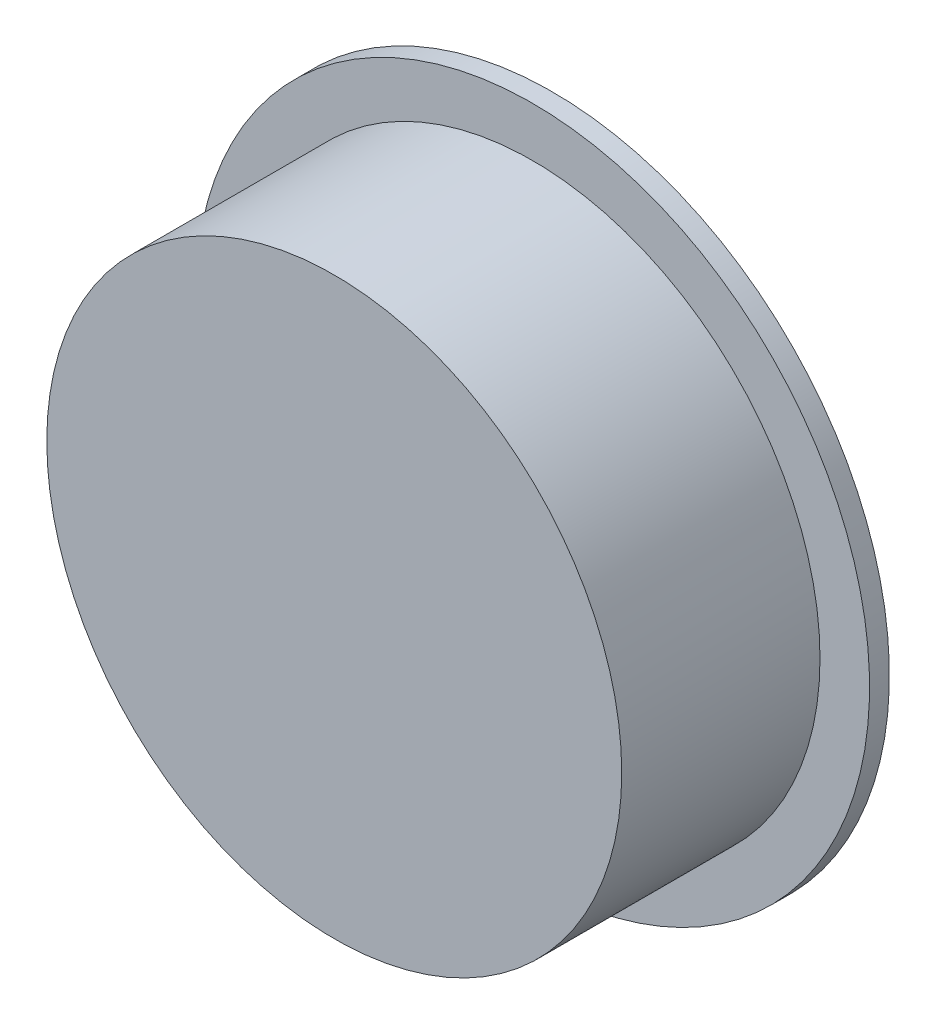
ISO-10303-21;
HEADER;
FILE_DESCRIPTION(('STEP AP214'),'2;1');
FILE_NAME('part.step','',(''),(''),'','','');
FILE_SCHEMA(('AUTOMOTIVE_DESIGN { 1 0 10303 214 1 1 1 1 }'));
ENDSEC;
DATA;
#1=APPLICATION_CONTEXT('core data for automotive mechanical design processes');
#2=APPLICATION_PROTOCOL_DEFINITION('international standard','automotive_design',2000,#1);
#3=PRODUCT_CONTEXT('',#1,'mechanical');
#4=PRODUCT('Part','Part','',(#3));
#5=PRODUCT_RELATED_PRODUCT_CATEGORY('part','',(#4));
#6=PRODUCT_DEFINITION_FORMATION('','',#4);
#7=PRODUCT_DEFINITION_CONTEXT('part definition',#1,'design');
#8=PRODUCT_DEFINITION('design','',#6,#7);
#9=PRODUCT_DEFINITION_SHAPE('','',#8);
#10=(LENGTH_UNIT() NAMED_UNIT(*) SI_UNIT(.MILLI.,.METRE.));
#11=(NAMED_UNIT(*) PLANE_ANGLE_UNIT() SI_UNIT($,.RADIAN.));
#12=(NAMED_UNIT(*) SI_UNIT($,.STERADIAN.) SOLID_ANGLE_UNIT());
#13=UNCERTAINTY_MEASURE_WITH_UNIT(LENGTH_MEASURE(1.E-05),#10,'distance_accuracy_value','');
#14=(GEOMETRIC_REPRESENTATION_CONTEXT(3) GLOBAL_UNCERTAINTY_ASSIGNED_CONTEXT((#13)) GLOBAL_UNIT_ASSIGNED_CONTEXT((#10,
#11,#12)) REPRESENTATION_CONTEXT('',''));
#15=CARTESIAN_POINT('',(0.,0.,0.));
#16=DIRECTION('',(0.,0.,1.));
#17=DIRECTION('',(1.,0.,0.));
#18=AXIS2_PLACEMENT_3D('',#15,#16,#17);
#19=CARTESIAN_POINT('',(0.,0.,5.));
#20=DIRECTION('',(0.,0.,-1.));
#21=DIRECTION('',(-1.,0.,0.));
#22=AXIS2_PLACEMENT_3D('',#19,#20,#21);
#23=CYLINDRICAL_SURFACE('',#22,7.25);
#24=CARTESIAN_POINT('',(0.,0.,5.));
#25=DIRECTION('',(0.,0.,1.));
#26=DIRECTION('',(1.,0.,0.));
#27=AXIS2_PLACEMENT_3D('',#24,#25,#26);
#28=CIRCLE('',#27,7.25);
#29=CARTESIAN_POINT('',(7.25,0.,5.));
#30=VERTEX_POINT('',#29);
#31=EDGE_CURVE('E10',#30,#30,#28,.T.);
#32=ORIENTED_EDGE('',*,*,#31,.F.);
#33=EDGE_LOOP('',(#32));
#34=FACE_BOUND('',#33,.T.);
#35=CARTESIAN_POINT('',(0.,0.,0.));
#36=DIRECTION('',(0.,0.,-1.));
#37=DIRECTION('',(-1.,0.,0.));
#38=AXIS2_PLACEMENT_3D('',#35,#36,#37);
#39=CIRCLE('',#38,7.25);
#40=CARTESIAN_POINT('',(-7.25,0.,0.));
#41=VERTEX_POINT('',#40);
#42=EDGE_CURVE('E37',#41,#41,#39,.T.);
#43=ORIENTED_EDGE('',*,*,#42,.F.);
#44=EDGE_LOOP('',(#43));
#45=FACE_BOUND('',#44,.T.);
#46=ADVANCED_FACE('F31',(#34,#45),#23,.T.);
#47=CARTESIAN_POINT('',(0.,0.,5.));
#48=DIRECTION('',(0.,0.,1.));
#49=DIRECTION('',(1.,0.,0.));
#50=AXIS2_PLACEMENT_3D('',#47,#48,#49);
#51=PLANE('',#50);
#52=ORIENTED_EDGE('',*,*,#31,.T.);
#53=EDGE_LOOP('',(#52));
#54=FACE_BOUND('',#53,.T.);
#55=ADVANCED_FACE('F79',(#54),#51,.T.);
#56=CARTESIAN_POINT('',(0.,0.,0.));
#57=DIRECTION('',(0.,0.,-1.));
#58=DIRECTION('',(-1.,0.,0.));
#59=AXIS2_PLACEMENT_3D('',#56,#57,#58);
#60=PLANE('',#59);
#61=CARTESIAN_POINT('',(0.,0.,0.));
#62=DIRECTION('',(0.,0.,-1.));
#63=DIRECTION('',(-1.,0.,0.));
#64=AXIS2_PLACEMENT_3D('',#61,#62,#63);
#65=CIRCLE('',#64,8.5);
#66=CARTESIAN_POINT('',(-8.5,0.,0.));
#67=VERTEX_POINT('',#66);
#68=EDGE_CURVE('E45',#67,#67,#65,.T.);
#69=ORIENTED_EDGE('',*,*,#68,.F.);
#70=EDGE_LOOP('',(#69));
#71=FACE_BOUND('',#70,.T.);
#72=ORIENTED_EDGE('',*,*,#42,.T.);
#73=EDGE_LOOP('',(#72));
#74=FACE_BOUND('',#73,.T.);
#75=ADVANCED_FACE('F74',(#71,#74),#60,.F.);
#76=CARTESIAN_POINT('',(0.,0.,-0.5));
#77=DIRECTION('',(0.,0.,1.));
#78=DIRECTION('',(1.,0.,0.));
#79=AXIS2_PLACEMENT_3D('',#76,#77,#78);
#80=CYLINDRICAL_SURFACE('',#79,8.5);
#81=CARTESIAN_POINT('',(0.,0.,-0.5));
#82=DIRECTION('',(0.,0.,-1.));
#83=DIRECTION('',(-1.,0.,0.));
#84=AXIS2_PLACEMENT_3D('',#81,#82,#83);
#85=CIRCLE('',#84,8.5);
#86=CARTESIAN_POINT('',(-8.5,0.,-0.5));
#87=VERTEX_POINT('',#86);
#88=EDGE_CURVE('E41',#87,#87,#85,.T.);
#89=ORIENTED_EDGE('',*,*,#88,.F.);
#90=EDGE_LOOP('',(#89));
#91=FACE_BOUND('',#90,.T.);
#92=ORIENTED_EDGE('',*,*,#68,.T.);
#93=EDGE_LOOP('',(#92));
#94=FACE_BOUND('',#93,.T.);
#95=ADVANCED_FACE('F68',(#91,#94),#80,.T.);
#96=CARTESIAN_POINT('',(0.,0.,-0.5));
#97=DIRECTION('',(0.,0.,-1.));
#98=DIRECTION('',(-1.,0.,0.));
#99=AXIS2_PLACEMENT_3D('',#96,#97,#98);
#100=PLANE('',#99);
#101=CARTESIAN_POINT('',(0.,0.,-0.5));
#102=DIRECTION('',(0.,0.,-1.));
#103=DIRECTION('',(-1.,0.,0.));
#104=AXIS2_PLACEMENT_3D('',#101,#102,#103);
#105=CIRCLE('',#104,1.75);
#106=CARTESIAN_POINT('',(-1.75,0.,-0.5));
#107=VERTEX_POINT('',#106);
#108=EDGE_CURVE('E51',#107,#107,#105,.T.);
#109=ORIENTED_EDGE('',*,*,#108,.F.);
#110=EDGE_LOOP('',(#109));
#111=FACE_BOUND('',#110,.T.);
#112=ORIENTED_EDGE('',*,*,#88,.T.);
#113=EDGE_LOOP('',(#112));
#114=FACE_BOUND('',#113,.T.);
#115=ADVANCED_FACE('F62',(#111,#114),#100,.T.);
#116=CARTESIAN_POINT('',(0.,0.,0.25));
#117=DIRECTION('',(0.,0.,-1.));
#118=DIRECTION('',(-1.,0.,0.));
#119=AXIS2_PLACEMENT_3D('',#116,#117,#118);
#120=CYLINDRICAL_SURFACE('',#119,1.75);
#121=CARTESIAN_POINT('',(0.,0.,0.25));
#122=DIRECTION('',(0.,0.,-1.));
#123=DIRECTION('',(-1.,0.,0.));
#124=AXIS2_PLACEMENT_3D('',#121,#122,#123);
#125=CIRCLE('',#124,1.75);
#126=CARTESIAN_POINT('',(-1.75,0.,0.25));
#127=VERTEX_POINT('',#126);
#128=EDGE_CURVE('E49',#127,#127,#125,.T.);
#129=ORIENTED_EDGE('',*,*,#128,.F.);
#130=EDGE_LOOP('',(#129));
#131=FACE_BOUND('',#130,.T.);
#132=ORIENTED_EDGE('',*,*,#108,.T.);
#133=EDGE_LOOP('',(#132));
#134=FACE_BOUND('',#133,.T.);
#135=ADVANCED_FACE('F59',(#131,#134),#120,.F.);
#136=CARTESIAN_POINT('',(0.,0.,0.25));
#137=DIRECTION('',(0.,0.,-1.));
#138=DIRECTION('',(-1.,0.,0.));
#139=AXIS2_PLACEMENT_3D('',#136,#137,#138);
#140=PLANE('',#139);
#141=ORIENTED_EDGE('',*,*,#128,.T.);
#142=EDGE_LOOP('',(#141));
#143=FACE_BOUND('',#142,.T.);
#144=ADVANCED_FACE('F57',(#143),#140,.T.);
#145=CLOSED_SHELL('',(#46,#55,#75,#95,#115,#135,#144));
#146=MANIFOLD_SOLID_BREP('B2',#145);
#147=ADVANCED_BREP_SHAPE_REPRESENTATION('',(#18,#146),#14);
#148=SHAPE_DEFINITION_REPRESENTATION(#9,#147);
ENDSEC;
END-ISO-10303-21;
